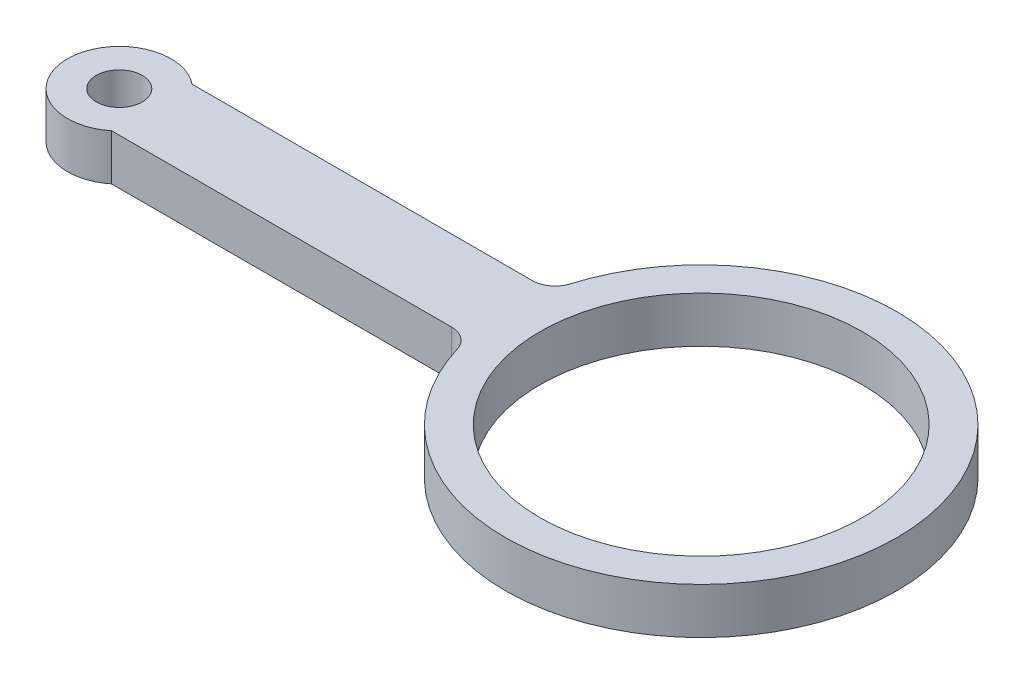
ISO-10303-21;
HEADER;
FILE_DESCRIPTION(('STEP AP214'),'2;1');
FILE_NAME('part.step','',(''),(''),'','','');
FILE_SCHEMA(('AUTOMOTIVE_DESIGN { 1 0 10303 214 1 1 1 1 }'));
ENDSEC;
DATA;
#1=APPLICATION_CONTEXT('core data for automotive mechanical design processes');
#2=APPLICATION_PROTOCOL_DEFINITION('international standard','automotive_design',2000,#1);
#3=PRODUCT_CONTEXT('',#1,'mechanical');
#4=PRODUCT('Part','Part','',(#3));
#5=PRODUCT_RELATED_PRODUCT_CATEGORY('part','',(#4));
#6=PRODUCT_DEFINITION_FORMATION('','',#4);
#7=PRODUCT_DEFINITION_CONTEXT('part definition',#1,'design');
#8=PRODUCT_DEFINITION('design','',#6,#7);
#9=PRODUCT_DEFINITION_SHAPE('','',#8);
#10=(LENGTH_UNIT() NAMED_UNIT(*) SI_UNIT(.MILLI.,.METRE.));
#11=(NAMED_UNIT(*) PLANE_ANGLE_UNIT() SI_UNIT($,.RADIAN.));
#12=(NAMED_UNIT(*) SI_UNIT($,.STERADIAN.) SOLID_ANGLE_UNIT());
#13=UNCERTAINTY_MEASURE_WITH_UNIT(LENGTH_MEASURE(1.E-05),#10,'distance_accuracy_value','');
#14=(GEOMETRIC_REPRESENTATION_CONTEXT(3) GLOBAL_UNCERTAINTY_ASSIGNED_CONTEXT((#13)) GLOBAL_UNIT_ASSIGNED_CONTEXT((#10,
#11,#12)) REPRESENTATION_CONTEXT('',''));
#15=CARTESIAN_POINT('',(0.,0.,0.));
#16=DIRECTION('',(0.,0.,1.));
#17=DIRECTION('',(1.,0.,0.));
#18=AXIS2_PLACEMENT_3D('',#15,#16,#17);
#19=CARTESIAN_POINT('',(8.35557464468319,2.,-0.434173759237168));
#20=DIRECTION('',(0.,1.,0.));
#21=DIRECTION('',(0.,0.,1.));
#22=AXIS2_PLACEMENT_3D('',#19,#20,#21);
#23=PLANE('',#22);
#24=CARTESIAN_POINT('',(17.4455746446832,2.,2.31582624076283));
#25=DIRECTION('',(0.,1.,0.));
#26=DIRECTION('',(0.,0.,1.));
#27=AXIS2_PLACEMENT_3D('',#24,#25,#26);
#28=CIRCLE('',#27,7.);
#29=CARTESIAN_POINT('',(17.4455746446832,2.,9.31582624076283));
#30=VERTEX_POINT('',#29);
#31=EDGE_CURVE('E132',#30,#30,#28,.T.);
#32=ORIENTED_EDGE('',*,*,#31,.F.);
#33=EDGE_LOOP('',(#32));
#34=FACE_BOUND('',#33,.T.);
#35=CARTESIAN_POINT('',(8.35557464468319,2.,-0.434173759237168));
#36=DIRECTION('',(0.,-1.,0.));
#37=DIRECTION('',(0.,0.,1.));
#38=AXIS2_PLACEMENT_3D('',#35,#36,#37);
#39=CIRCLE('',#38,1.);
#40=CARTESIAN_POINT('',(9.28840673565037,2.,-0.0738623799250515));
#41=VERTEX_POINT('',#40);
#42=CARTESIAN_POINT('',(8.35557464468319,2.,0.565826240762831));
#43=VERTEX_POINT('',#42);
#44=EDGE_CURVE('E139',#41,#43,#39,.T.);
#45=ORIENTED_EDGE('',*,*,#44,.T.);
#46=DIRECTION('',(-1.,0.,0.));
#47=VECTOR('',#46,1.);
#48=CARTESIAN_POINT('',(-6.41021179294372,2.,0.565826240762831));
#49=LINE('',#48,#47);
#50=CARTESIAN_POINT('',(-6.41021179294372,2.,0.565826240762831));
#51=VERTEX_POINT('',#50);
#52=EDGE_CURVE('E97',#43,#51,#49,.T.);
#53=ORIENTED_EDGE('',*,*,#52,.T.);
#54=CARTESIAN_POINT('',(-7.82442535531681,2.,2.31582624076283));
#55=DIRECTION('',(0.,1.,0.));
#56=DIRECTION('',(0.,0.,1.));
#57=AXIS2_PLACEMENT_3D('',#54,#55,#56);
#58=CIRCLE('',#57,2.25);
#59=CARTESIAN_POINT('',(-6.41021179294372,2.,4.06582624076283));
#60=VERTEX_POINT('',#59);
#61=EDGE_CURVE('E110',#51,#60,#58,.T.);
#62=ORIENTED_EDGE('',*,*,#61,.T.);
#63=DIRECTION('',(1.,0.,0.));
#64=VECTOR('',#63,1.);
#65=CARTESIAN_POINT('',(-6.41021179294372,2.,4.06582624076283));
#66=LINE('',#65,#64);
#67=CARTESIAN_POINT('',(8.35557464468319,2.,4.06582624076283));
#68=VERTEX_POINT('',#67);
#69=EDGE_CURVE('E104',#60,#68,#66,.T.);
#70=ORIENTED_EDGE('',*,*,#69,.T.);
#71=CARTESIAN_POINT('',(8.35557464468319,2.,5.06582624076283));
#72=DIRECTION('',(0.,-1.,0.));
#73=DIRECTION('',(0.,0.,1.));
#74=AXIS2_PLACEMENT_3D('',#71,#72,#73);
#75=CIRCLE('',#74,1.);
#76=CARTESIAN_POINT('',(9.28840673565037,2.,4.70551486145071));
#77=VERTEX_POINT('',#76);
#78=EDGE_CURVE('E108',#68,#77,#75,.T.);
#79=ORIENTED_EDGE('',*,*,#78,.T.);
#80=CARTESIAN_POINT('',(17.4455746446832,2.,2.31582624076283));
#81=DIRECTION('',(0.,1.,0.));
#82=DIRECTION('',(0.,0.,1.));
#83=AXIS2_PLACEMENT_3D('',#80,#81,#82);
#84=CIRCLE('',#83,8.5);
#85=EDGE_CURVE('E60',#77,#41,#84,.T.);
#86=ORIENTED_EDGE('',*,*,#85,.T.);
#87=EDGE_LOOP('',(#45,#53,#62,#70,#79,#86));
#88=FACE_BOUND('',#87,.T.);
#89=CARTESIAN_POINT('',(-7.82442535531681,2.,2.31582624076283));
#90=DIRECTION('',(0.,1.,0.));
#91=DIRECTION('',(0.,0.,1.));
#92=AXIS2_PLACEMENT_3D('',#89,#90,#91);
#93=CIRCLE('',#92,1.);
#94=CARTESIAN_POINT('',(-7.82442535531681,2.,3.31582624076283));
#95=VERTEX_POINT('',#94);
#96=EDGE_CURVE('E181',#95,#95,#93,.T.);
#97=ORIENTED_EDGE('',*,*,#96,.F.);
#98=EDGE_LOOP('',(#97));
#99=FACE_BOUND('',#98,.T.);
#100=ADVANCED_FACE('F43',(#34,#88,#99),#23,.T.);
#101=CARTESIAN_POINT('',(8.35557464468319,0.,-0.434173759237168));
#102=DIRECTION('',(0.,1.,0.));
#103=DIRECTION('',(0.,0.,1.));
#104=AXIS2_PLACEMENT_3D('',#101,#102,#103);
#105=PLANE('',#104);
#106=CARTESIAN_POINT('',(8.35557464468319,0.,-0.434173759237168));
#107=DIRECTION('',(0.,-1.,0.));
#108=DIRECTION('',(0.,0.,1.));
#109=AXIS2_PLACEMENT_3D('',#106,#107,#108);
#110=CIRCLE('',#109,1.);
#111=CARTESIAN_POINT('',(9.28840673565037,0.,-0.0738623799250515));
#112=VERTEX_POINT('',#111);
#113=CARTESIAN_POINT('',(8.35557464468319,0.,0.565826240762831));
#114=VERTEX_POINT('',#113);
#115=EDGE_CURVE('E128',#112,#114,#110,.T.);
#116=ORIENTED_EDGE('',*,*,#115,.F.);
#117=CARTESIAN_POINT('',(17.4455746446832,0.,2.31582624076283));
#118=DIRECTION('',(0.,1.,0.));
#119=DIRECTION('',(0.,0.,1.));
#120=AXIS2_PLACEMENT_3D('',#117,#118,#119);
#121=CIRCLE('',#120,8.5);
#122=CARTESIAN_POINT('',(9.28840673565037,0.,4.70551486145071));
#123=VERTEX_POINT('',#122);
#124=EDGE_CURVE('E89',#123,#112,#121,.T.);
#125=ORIENTED_EDGE('',*,*,#124,.F.);
#126=CARTESIAN_POINT('',(8.35557464468319,0.,5.06582624076283));
#127=DIRECTION('',(0.,-1.,0.));
#128=DIRECTION('',(0.,0.,1.));
#129=AXIS2_PLACEMENT_3D('',#126,#127,#128);
#130=CIRCLE('',#129,1.);
#131=CARTESIAN_POINT('',(8.35557464468319,0.,4.06582624076283));
#132=VERTEX_POINT('',#131);
#133=EDGE_CURVE('E83',#132,#123,#130,.T.);
#134=ORIENTED_EDGE('',*,*,#133,.F.);
#135=DIRECTION('',(1.,0.,0.));
#136=VECTOR('',#135,1.);
#137=CARTESIAN_POINT('',(-6.41021179294372,0.,4.06582624076283));
#138=LINE('',#137,#136);
#139=CARTESIAN_POINT('',(-6.41021179294372,0.,4.06582624076283));
#140=VERTEX_POINT('',#139);
#141=EDGE_CURVE('E118',#140,#132,#138,.T.);
#142=ORIENTED_EDGE('',*,*,#141,.F.);
#143=CARTESIAN_POINT('',(-7.82442535531681,0.,2.31582624076283));
#144=DIRECTION('',(0.,1.,0.));
#145=DIRECTION('',(0.,0.,1.));
#146=AXIS2_PLACEMENT_3D('',#143,#144,#145);
#147=CIRCLE('',#146,2.25);
#148=CARTESIAN_POINT('',(-6.41021179294372,0.,0.565826240762831));
#149=VERTEX_POINT('',#148);
#150=EDGE_CURVE('E134',#149,#140,#147,.T.);
#151=ORIENTED_EDGE('',*,*,#150,.F.);
#152=DIRECTION('',(-1.,0.,0.));
#153=VECTOR('',#152,1.);
#154=CARTESIAN_POINT('',(-6.41021179294372,0.,0.565826240762831));
#155=LINE('',#154,#153);
#156=EDGE_CURVE('E131',#114,#149,#155,.T.);
#157=ORIENTED_EDGE('',*,*,#156,.F.);
#158=EDGE_LOOP('',(#116,#125,#134,#142,#151,#157));
#159=FACE_BOUND('',#158,.T.);
#160=CARTESIAN_POINT('',(17.4455746446832,0.,2.31582624076283));
#161=DIRECTION('',(0.,1.,0.));
#162=DIRECTION('',(0.,0.,1.));
#163=AXIS2_PLACEMENT_3D('',#160,#161,#162);
#164=CIRCLE('',#163,7.);
#165=CARTESIAN_POINT('',(17.4455746446832,0.,9.31582624076283));
#166=VERTEX_POINT('',#165);
#167=EDGE_CURVE('E187',#166,#166,#164,.T.);
#168=ORIENTED_EDGE('',*,*,#167,.T.);
#169=EDGE_LOOP('',(#168));
#170=FACE_BOUND('',#169,.T.);
#171=CARTESIAN_POINT('',(-7.82442535531681,0.,2.31582624076283));
#172=DIRECTION('',(0.,1.,0.));
#173=DIRECTION('',(0.,0.,1.));
#174=AXIS2_PLACEMENT_3D('',#171,#172,#173);
#175=CIRCLE('',#174,1.);
#176=CARTESIAN_POINT('',(-7.82442535531681,0.,3.31582624076283));
#177=VERTEX_POINT('',#176);
#178=EDGE_CURVE('E184',#177,#177,#175,.T.);
#179=ORIENTED_EDGE('',*,*,#178,.T.);
#180=EDGE_LOOP('',(#179));
#181=FACE_BOUND('',#180,.T.);
#182=ADVANCED_FACE('F148',(#159,#170,#181),#105,.F.);
#183=CARTESIAN_POINT('',(8.35557464468319,2.,-0.434173759237168));
#184=DIRECTION('',(0.,-1.,0.));
#185=DIRECTION('',(0.,0.,-1.));
#186=AXIS2_PLACEMENT_3D('',#183,#184,#185);
#187=CYLINDRICAL_SURFACE('',#186,1.);
#188=ORIENTED_EDGE('',*,*,#115,.T.);
#189=DIRECTION('',(0.,-1.,0.));
#190=VECTOR('',#189,1.);
#191=CARTESIAN_POINT('',(8.35557464468319,2.,0.565826240762831));
#192=LINE('',#191,#190);
#193=EDGE_CURVE('E11',#43,#114,#192,.T.);
#194=ORIENTED_EDGE('',*,*,#193,.F.);
#195=ORIENTED_EDGE('',*,*,#44,.F.);
#196=DIRECTION('',(0.,-1.,0.));
#197=VECTOR('',#196,1.);
#198=CARTESIAN_POINT('',(9.28840673565037,2.,-0.0738623799250515));
#199=LINE('',#198,#197);
#200=EDGE_CURVE('E124',#41,#112,#199,.T.);
#201=ORIENTED_EDGE('',*,*,#200,.T.);
#202=EDGE_LOOP('',(#188,#194,#195,#201));
#203=FACE_BOUND('',#202,.T.);
#204=ADVANCED_FACE('F45',(#203),#187,.F.);
#205=CARTESIAN_POINT('',(-6.41021179294372,2.,0.565826240762831));
#206=DIRECTION('',(0.,0.,1.));
#207=DIRECTION('',(1.,0.,0.));
#208=AXIS2_PLACEMENT_3D('',#205,#206,#207);
#209=PLANE('',#208);
#210=ORIENTED_EDGE('',*,*,#156,.T.);
#211=DIRECTION('',(0.,-1.,0.));
#212=VECTOR('',#211,1.);
#213=CARTESIAN_POINT('',(-6.41021179294372,2.,0.565826240762831));
#214=LINE('',#213,#212);
#215=EDGE_CURVE('E52',#51,#149,#214,.T.);
#216=ORIENTED_EDGE('',*,*,#215,.F.);
#217=ORIENTED_EDGE('',*,*,#52,.F.);
#218=ORIENTED_EDGE('',*,*,#193,.T.);
#219=EDGE_LOOP('',(#210,#216,#217,#218));
#220=FACE_BOUND('',#219,.T.);
#221=ADVANCED_FACE('F230',(#220),#209,.F.);
#222=CARTESIAN_POINT('',(-7.82442535531681,2.,2.31582624076283));
#223=DIRECTION('',(0.,-1.,0.));
#224=DIRECTION('',(0.,0.,-1.));
#225=AXIS2_PLACEMENT_3D('',#222,#223,#224);
#226=CYLINDRICAL_SURFACE('',#225,2.25);
#227=ORIENTED_EDGE('',*,*,#150,.T.);
#228=DIRECTION('',(0.,-1.,0.));
#229=VECTOR('',#228,1.);
#230=CARTESIAN_POINT('',(-6.41021179294372,2.,4.06582624076283));
#231=LINE('',#230,#229);
#232=EDGE_CURVE('E119',#60,#140,#231,.T.);
#233=ORIENTED_EDGE('',*,*,#232,.F.);
#234=ORIENTED_EDGE('',*,*,#61,.F.);
#235=ORIENTED_EDGE('',*,*,#215,.T.);
#236=EDGE_LOOP('',(#227,#233,#234,#235));
#237=FACE_BOUND('',#236,.T.);
#238=ADVANCED_FACE('F145',(#237),#226,.T.);
#239=CARTESIAN_POINT('',(-6.41021179294372,2.,4.06582624076283));
#240=DIRECTION('',(0.,0.,-1.));
#241=DIRECTION('',(-1.,0.,0.));
#242=AXIS2_PLACEMENT_3D('',#239,#240,#241);
#243=PLANE('',#242);
#244=ORIENTED_EDGE('',*,*,#141,.T.);
#245=DIRECTION('',(0.,-1.,0.));
#246=VECTOR('',#245,1.);
#247=CARTESIAN_POINT('',(8.35557464468319,2.,4.06582624076283));
#248=LINE('',#247,#246);
#249=EDGE_CURVE('E115',#68,#132,#248,.T.);
#250=ORIENTED_EDGE('',*,*,#249,.F.);
#251=ORIENTED_EDGE('',*,*,#69,.F.);
#252=ORIENTED_EDGE('',*,*,#232,.T.);
#253=EDGE_LOOP('',(#244,#250,#251,#252));
#254=FACE_BOUND('',#253,.T.);
#255=ADVANCED_FACE('F116',(#254),#243,.F.);
#256=CARTESIAN_POINT('',(8.35557464468319,2.,5.06582624076283));
#257=DIRECTION('',(0.,-1.,0.));
#258=DIRECTION('',(0.,0.,-1.));
#259=AXIS2_PLACEMENT_3D('',#256,#257,#258);
#260=CYLINDRICAL_SURFACE('',#259,1.);
#261=ORIENTED_EDGE('',*,*,#133,.T.);
#262=DIRECTION('',(0.,-1.,0.));
#263=VECTOR('',#262,1.);
#264=CARTESIAN_POINT('',(9.28840673565037,2.,4.70551486145071));
#265=LINE('',#264,#263);
#266=EDGE_CURVE('E120',#77,#123,#265,.T.);
#267=ORIENTED_EDGE('',*,*,#266,.F.);
#268=ORIENTED_EDGE('',*,*,#78,.F.);
#269=ORIENTED_EDGE('',*,*,#249,.T.);
#270=EDGE_LOOP('',(#261,#267,#268,#269));
#271=FACE_BOUND('',#270,.T.);
#272=ADVANCED_FACE('F122',(#271),#260,.F.);
#273=CARTESIAN_POINT('',(17.4455746446832,2.,2.31582624076283));
#274=DIRECTION('',(0.,-1.,0.));
#275=DIRECTION('',(0.,0.,-1.));
#276=AXIS2_PLACEMENT_3D('',#273,#274,#275);
#277=CYLINDRICAL_SURFACE('',#276,8.5);
#278=ORIENTED_EDGE('',*,*,#124,.T.);
#279=ORIENTED_EDGE('',*,*,#200,.F.);
#280=ORIENTED_EDGE('',*,*,#85,.F.);
#281=ORIENTED_EDGE('',*,*,#266,.T.);
#282=EDGE_LOOP('',(#278,#279,#280,#281));
#283=FACE_BOUND('',#282,.T.);
#284=ADVANCED_FACE('F153',(#283),#277,.T.);
#285=CARTESIAN_POINT('',(17.4455746446832,2.,2.31582624076283));
#286=DIRECTION('',(0.,-1.,0.));
#287=DIRECTION('',(0.,0.,-1.));
#288=AXIS2_PLACEMENT_3D('',#285,#286,#287);
#289=CYLINDRICAL_SURFACE('',#288,7.);
#290=ORIENTED_EDGE('',*,*,#31,.T.);
#291=EDGE_LOOP('',(#290));
#292=FACE_BOUND('',#291,.T.);
#293=ORIENTED_EDGE('',*,*,#167,.F.);
#294=EDGE_LOOP('',(#293));
#295=FACE_BOUND('',#294,.T.);
#296=ADVANCED_FACE('F155',(#292,#295),#289,.F.);
#297=CARTESIAN_POINT('',(-7.82442535531681,2.,2.31582624076283));
#298=DIRECTION('',(0.,-1.,0.));
#299=DIRECTION('',(0.,0.,-1.));
#300=AXIS2_PLACEMENT_3D('',#297,#298,#299);
#301=CYLINDRICAL_SURFACE('',#300,1.);
#302=ORIENTED_EDGE('',*,*,#96,.T.);
#303=EDGE_LOOP('',(#302));
#304=FACE_BOUND('',#303,.T.);
#305=ORIENTED_EDGE('',*,*,#178,.F.);
#306=EDGE_LOOP('',(#305));
#307=FACE_BOUND('',#306,.T.);
#308=ADVANCED_FACE('F161',(#304,#307),#301,.F.);
#309=CLOSED_SHELL('',(#100,#182,#204,#221,#238,#255,#272,#284,#296,#308));
#310=MANIFOLD_SOLID_BREP('B2',#309);
#311=ADVANCED_BREP_SHAPE_REPRESENTATION('',(#18,#310),#14);
#312=SHAPE_DEFINITION_REPRESENTATION(#9,#311);
ENDSEC;
END-ISO-10303-21;
